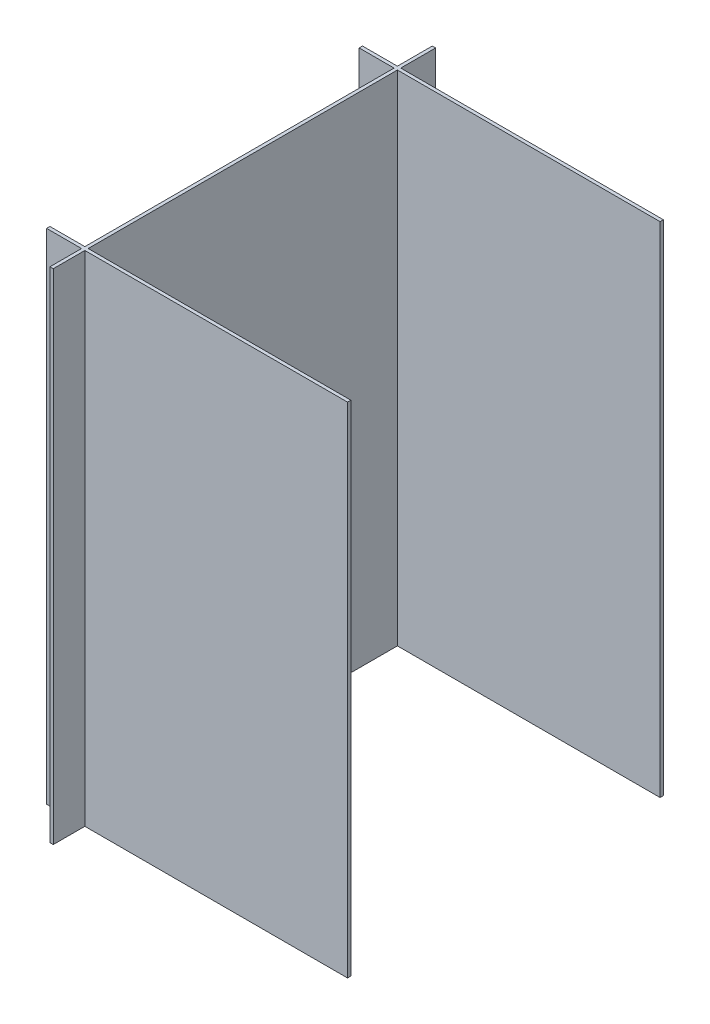
ISO-10303-21;
HEADER;
FILE_DESCRIPTION(('STEP AP214'),'2;1');
FILE_NAME('part.step','',(''),(''),'','','');
FILE_SCHEMA(('AUTOMOTIVE_DESIGN { 1 0 10303 214 1 1 1 1 }'));
ENDSEC;
DATA;
#1=APPLICATION_CONTEXT('core data for automotive mechanical design processes');
#2=APPLICATION_PROTOCOL_DEFINITION('international standard','automotive_design',2000,#1);
#3=PRODUCT_CONTEXT('',#1,'mechanical');
#4=PRODUCT('Part','Part','',(#3));
#5=PRODUCT_RELATED_PRODUCT_CATEGORY('part','',(#4));
#6=PRODUCT_DEFINITION_FORMATION('','',#4);
#7=PRODUCT_DEFINITION_CONTEXT('part definition',#1,'design');
#8=PRODUCT_DEFINITION('design','',#6,#7);
#9=PRODUCT_DEFINITION_SHAPE('','',#8);
#10=(LENGTH_UNIT() NAMED_UNIT(*) SI_UNIT(.MILLI.,.METRE.));
#11=(NAMED_UNIT(*) PLANE_ANGLE_UNIT() SI_UNIT($,.RADIAN.));
#12=(NAMED_UNIT(*) SI_UNIT($,.STERADIAN.) SOLID_ANGLE_UNIT());
#13=UNCERTAINTY_MEASURE_WITH_UNIT(LENGTH_MEASURE(1.E-05),#10,'distance_accuracy_value','');
#14=(GEOMETRIC_REPRESENTATION_CONTEXT(3) GLOBAL_UNCERTAINTY_ASSIGNED_CONTEXT((#13)) GLOBAL_UNIT_ASSIGNED_CONTEXT((#10,
#11,#12)) REPRESENTATION_CONTEXT('',''));
#15=CARTESIAN_POINT('',(0.,0.,0.));
#16=DIRECTION('',(0.,0.,1.));
#17=DIRECTION('',(1.,0.,0.));
#18=AXIS2_PLACEMENT_3D('',#15,#16,#17);
#19=CARTESIAN_POINT('',(-56.1616111521953,300.,42.3022668872637));
#20=DIRECTION('',(1.,0.,0.));
#21=DIRECTION('',(0.,0.,-1.));
#22=AXIS2_PLACEMENT_3D('',#19,#20,#21);
#23=PLANE('',#22);
#24=DIRECTION('',(0.,0.,1.));
#25=VECTOR('',#24,1.);
#26=CARTESIAN_POINT('',(-56.1616111521953,0.,42.3022668872637));
#27=LINE('',#26,#25);
#28=CARTESIAN_POINT('',(-56.1616111521953,0.,42.3022668872637));
#29=VERTEX_POINT('',#28);
#30=CARTESIAN_POINT('',(-56.1616111521953,0.,44.3022668872637));
#31=VERTEX_POINT('',#30);
#32=EDGE_CURVE('E206',#29,#31,#27,.T.);
#33=ORIENTED_EDGE('',*,*,#32,.T.);
#34=DIRECTION('',(0.,-1.,0.));
#35=VECTOR('',#34,1.);
#36=CARTESIAN_POINT('',(-56.1616111521953,300.,44.3022668872637));
#37=LINE('',#36,#35);
#38=CARTESIAN_POINT('',(-56.1616111521953,300.,44.3022668872637));
#39=VERTEX_POINT('',#38);
#40=EDGE_CURVE('E11',#39,#31,#37,.T.);
#41=ORIENTED_EDGE('',*,*,#40,.F.);
#42=DIRECTION('',(0.,0.,1.));
#43=VECTOR('',#42,1.);
#44=CARTESIAN_POINT('',(-56.1616111521953,300.,42.3022668872637));
#45=LINE('',#44,#43);
#46=CARTESIAN_POINT('',(-56.1616111521953,300.,42.3022668872637));
#47=VERTEX_POINT('',#46);
#48=EDGE_CURVE('E244',#47,#39,#45,.T.);
#49=ORIENTED_EDGE('',*,*,#48,.F.);
#50=DIRECTION('',(0.,-1.,0.));
#51=VECTOR('',#50,1.);
#52=CARTESIAN_POINT('',(-56.1616111521953,300.,42.3022668872637));
#53=LINE('',#52,#51);
#54=EDGE_CURVE('E202',#47,#29,#53,.T.);
#55=ORIENTED_EDGE('',*,*,#54,.T.);
#56=EDGE_LOOP('',(#33,#41,#49,#55));
#57=FACE_BOUND('',#56,.T.);
#58=ADVANCED_FACE('F38',(#57),#23,.F.);
#59=CARTESIAN_POINT('',(-56.1616111521953,300.,44.3022668872637));
#60=DIRECTION('',(0.,0.,-1.));
#61=DIRECTION('',(-1.,0.,0.));
#62=AXIS2_PLACEMENT_3D('',#59,#60,#61);
#63=PLANE('',#62);
#64=DIRECTION('',(1.,0.,0.));
#65=VECTOR('',#64,1.);
#66=CARTESIAN_POINT('',(-56.1616111521953,0.,44.3022668872637));
#67=LINE('',#66,#65);
#68=CARTESIAN_POINT('',(-35.1616111521953,0.,44.3022668872637));
#69=VERTEX_POINT('',#68);
#70=EDGE_CURVE('E209',#31,#69,#67,.T.);
#71=ORIENTED_EDGE('',*,*,#70,.T.);
#72=DIRECTION('',(0.,-1.,0.));
#73=VECTOR('',#72,1.);
#74=CARTESIAN_POINT('',(-35.1616111521953,300.,44.3022668872637));
#75=LINE('',#74,#73);
#76=CARTESIAN_POINT('',(-35.1616111521953,300.,44.3022668872637));
#77=VERTEX_POINT('',#76);
#78=EDGE_CURVE('E46',#77,#69,#75,.T.);
#79=ORIENTED_EDGE('',*,*,#78,.F.);
#80=DIRECTION('',(1.,0.,0.));
#81=VECTOR('',#80,1.);
#82=CARTESIAN_POINT('',(-56.1616111521953,300.,44.3022668872637));
#83=LINE('',#82,#81);
#84=EDGE_CURVE('E133',#39,#77,#83,.T.);
#85=ORIENTED_EDGE('',*,*,#84,.F.);
#86=ORIENTED_EDGE('',*,*,#40,.T.);
#87=EDGE_LOOP('',(#71,#79,#85,#86));
#88=FACE_BOUND('',#87,.T.);
#89=ADVANCED_FACE('F362',(#88),#63,.F.);
#90=CARTESIAN_POINT('',(-35.1616111521953,300.,44.3022668872637));
#91=DIRECTION('',(1.,0.,0.));
#92=DIRECTION('',(0.,0.,-1.));
#93=AXIS2_PLACEMENT_3D('',#90,#91,#92);
#94=PLANE('',#93);
#95=DIRECTION('',(0.,0.,1.));
#96=VECTOR('',#95,1.);
#97=CARTESIAN_POINT('',(-35.1616111521953,0.,44.3022668872637));
#98=LINE('',#97,#96);
#99=CARTESIAN_POINT('',(-35.1616111521953,0.,230.302266887264));
#100=VERTEX_POINT('',#99);
#101=EDGE_CURVE('E211',#69,#100,#98,.T.);
#102=ORIENTED_EDGE('',*,*,#101,.T.);
#103=DIRECTION('',(0.,-1.,0.));
#104=VECTOR('',#103,1.);
#105=CARTESIAN_POINT('',(-35.1616111521953,300.,230.302266887264));
#106=LINE('',#105,#104);
#107=CARTESIAN_POINT('',(-35.1616111521953,300.,230.302266887264));
#108=VERTEX_POINT('',#107);
#109=EDGE_CURVE('E287',#108,#100,#106,.T.);
#110=ORIENTED_EDGE('',*,*,#109,.F.);
#111=DIRECTION('',(0.,0.,1.));
#112=VECTOR('',#111,1.);
#113=CARTESIAN_POINT('',(-35.1616111521953,300.,44.3022668872637));
#114=LINE('',#113,#112);
#115=EDGE_CURVE('E295',#77,#108,#114,.T.);
#116=ORIENTED_EDGE('',*,*,#115,.F.);
#117=ORIENTED_EDGE('',*,*,#78,.T.);
#118=EDGE_LOOP('',(#102,#110,#116,#117));
#119=FACE_BOUND('',#118,.T.);
#120=ADVANCED_FACE('F293',(#119),#94,.F.);
#121=CARTESIAN_POINT('',(-35.1616111521953,300.,230.302266887264));
#122=DIRECTION('',(0.,0.,1.));
#123=DIRECTION('',(1.,0.,0.));
#124=AXIS2_PLACEMENT_3D('',#121,#122,#123);
#125=PLANE('',#124);
#126=DIRECTION('',(-1.,0.,0.));
#127=VECTOR('',#126,1.);
#128=CARTESIAN_POINT('',(-35.1616111521953,0.,230.302266887264));
#129=LINE('',#128,#127);
#130=CARTESIAN_POINT('',(-56.1616111521953,0.,230.302266887264));
#131=VERTEX_POINT('',#130);
#132=EDGE_CURVE('E213',#100,#131,#129,.T.);
#133=ORIENTED_EDGE('',*,*,#132,.T.);
#134=DIRECTION('',(0.,-1.,0.));
#135=VECTOR('',#134,1.);
#136=CARTESIAN_POINT('',(-56.1616111521953,300.,230.302266887264));
#137=LINE('',#136,#135);
#138=CARTESIAN_POINT('',(-56.1616111521953,300.,230.302266887264));
#139=VERTEX_POINT('',#138);
#140=EDGE_CURVE('E284',#139,#131,#137,.T.);
#141=ORIENTED_EDGE('',*,*,#140,.F.);
#142=DIRECTION('',(-1.,0.,0.));
#143=VECTOR('',#142,1.);
#144=CARTESIAN_POINT('',(-35.1616111521953,300.,230.302266887264));
#145=LINE('',#144,#143);
#146=EDGE_CURVE('E313',#108,#139,#145,.T.);
#147=ORIENTED_EDGE('',*,*,#146,.F.);
#148=ORIENTED_EDGE('',*,*,#109,.T.);
#149=EDGE_LOOP('',(#133,#141,#147,#148));
#150=FACE_BOUND('',#149,.T.);
#151=ADVANCED_FACE('F304',(#150),#125,.F.);
#152=CARTESIAN_POINT('',(-56.1616111521953,300.,230.302266887264));
#153=DIRECTION('',(1.,0.,0.));
#154=DIRECTION('',(0.,0.,-1.));
#155=AXIS2_PLACEMENT_3D('',#152,#153,#154);
#156=PLANE('',#155);
#157=DIRECTION('',(0.,0.,1.));
#158=VECTOR('',#157,1.);
#159=CARTESIAN_POINT('',(-56.1616111521953,0.,230.302266887264));
#160=LINE('',#159,#158);
#161=CARTESIAN_POINT('',(-56.1616111521953,0.,232.302266887264));
#162=VERTEX_POINT('',#161);
#163=EDGE_CURVE('E215',#131,#162,#160,.T.);
#164=ORIENTED_EDGE('',*,*,#163,.T.);
#165=DIRECTION('',(0.,-1.,0.));
#166=VECTOR('',#165,1.);
#167=CARTESIAN_POINT('',(-56.1616111521953,300.,232.302266887264));
#168=LINE('',#167,#166);
#169=CARTESIAN_POINT('',(-56.1616111521953,300.,232.302266887264));
#170=VERTEX_POINT('',#169);
#171=EDGE_CURVE('E281',#170,#162,#168,.T.);
#172=ORIENTED_EDGE('',*,*,#171,.F.);
#173=DIRECTION('',(0.,0.,1.));
#174=VECTOR('',#173,1.);
#175=CARTESIAN_POINT('',(-56.1616111521953,300.,230.302266887264));
#176=LINE('',#175,#174);
#177=EDGE_CURVE('E310',#139,#170,#176,.T.);
#178=ORIENTED_EDGE('',*,*,#177,.F.);
#179=ORIENTED_EDGE('',*,*,#140,.T.);
#180=EDGE_LOOP('',(#164,#172,#178,#179));
#181=FACE_BOUND('',#180,.T.);
#182=ADVANCED_FACE('F308',(#181),#156,.F.);
#183=CARTESIAN_POINT('',(-56.1616111521953,300.,232.302266887264));
#184=DIRECTION('',(0.,0.,-1.));
#185=DIRECTION('',(-1.,0.,0.));
#186=AXIS2_PLACEMENT_3D('',#183,#184,#185);
#187=PLANE('',#186);
#188=DIRECTION('',(1.,0.,0.));
#189=VECTOR('',#188,1.);
#190=CARTESIAN_POINT('',(-56.1616111521953,0.,232.302266887264));
#191=LINE('',#190,#189);
#192=CARTESIAN_POINT('',(-35.1616111521953,0.,232.302266887264));
#193=VERTEX_POINT('',#192);
#194=EDGE_CURVE('E217',#162,#193,#191,.T.);
#195=ORIENTED_EDGE('',*,*,#194,.T.);
#196=DIRECTION('',(0.,-1.,0.));
#197=VECTOR('',#196,1.);
#198=CARTESIAN_POINT('',(-35.1616111521953,300.,232.302266887264));
#199=LINE('',#198,#197);
#200=CARTESIAN_POINT('',(-35.1616111521953,300.,232.302266887264));
#201=VERTEX_POINT('',#200);
#202=EDGE_CURVE('E278',#201,#193,#199,.T.);
#203=ORIENTED_EDGE('',*,*,#202,.F.);
#204=DIRECTION('',(1.,0.,0.));
#205=VECTOR('',#204,1.);
#206=CARTESIAN_POINT('',(-56.1616111521953,300.,232.302266887264));
#207=LINE('',#206,#205);
#208=EDGE_CURVE('E312',#170,#201,#207,.T.);
#209=ORIENTED_EDGE('',*,*,#208,.F.);
#210=ORIENTED_EDGE('',*,*,#171,.T.);
#211=EDGE_LOOP('',(#195,#203,#209,#210));
#212=FACE_BOUND('',#211,.T.);
#213=ADVANCED_FACE('F375',(#212),#187,.F.);
#214=CARTESIAN_POINT('',(-35.1616111521953,300.,232.302266887264));
#215=DIRECTION('',(1.,0.,0.));
#216=DIRECTION('',(0.,0.,-1.));
#217=AXIS2_PLACEMENT_3D('',#214,#215,#216);
#218=PLANE('',#217);
#219=DIRECTION('',(0.,0.,1.));
#220=VECTOR('',#219,1.);
#221=CARTESIAN_POINT('',(-35.1616111521953,0.,232.302266887264));
#222=LINE('',#221,#220);
#223=CARTESIAN_POINT('',(-35.1616111521953,0.,251.302266887264));
#224=VERTEX_POINT('',#223);
#225=EDGE_CURVE('E219',#193,#224,#222,.T.);
#226=ORIENTED_EDGE('',*,*,#225,.T.);
#227=DIRECTION('',(0.,-1.,0.));
#228=VECTOR('',#227,1.);
#229=CARTESIAN_POINT('',(-35.1616111521953,300.,251.302266887264));
#230=LINE('',#229,#228);
#231=CARTESIAN_POINT('',(-35.1616111521953,300.,251.302266887264));
#232=VERTEX_POINT('',#231);
#233=EDGE_CURVE('E275',#232,#224,#230,.T.);
#234=ORIENTED_EDGE('',*,*,#233,.F.);
#235=DIRECTION('',(0.,0.,1.));
#236=VECTOR('',#235,1.);
#237=CARTESIAN_POINT('',(-35.1616111521953,300.,232.302266887264));
#238=LINE('',#237,#236);
#239=EDGE_CURVE('E315',#201,#232,#238,.T.);
#240=ORIENTED_EDGE('',*,*,#239,.F.);
#241=ORIENTED_EDGE('',*,*,#202,.T.);
#242=EDGE_LOOP('',(#226,#234,#240,#241));
#243=FACE_BOUND('',#242,.T.);
#244=ADVANCED_FACE('F378',(#243),#218,.F.);
#245=CARTESIAN_POINT('',(-35.1616111521953,300.,251.302266887264));
#246=DIRECTION('',(0.,0.,-1.));
#247=DIRECTION('',(-1.,0.,0.));
#248=AXIS2_PLACEMENT_3D('',#245,#246,#247);
#249=PLANE('',#248);
#250=DIRECTION('',(1.,0.,0.));
#251=VECTOR('',#250,1.);
#252=CARTESIAN_POINT('',(-35.1616111521953,0.,251.302266887264));
#253=LINE('',#252,#251);
#254=CARTESIAN_POINT('',(-33.1616111521953,0.,251.302266887264));
#255=VERTEX_POINT('',#254);
#256=EDGE_CURVE('E221',#224,#255,#253,.T.);
#257=ORIENTED_EDGE('',*,*,#256,.T.);
#258=DIRECTION('',(0.,-1.,0.));
#259=VECTOR('',#258,1.);
#260=CARTESIAN_POINT('',(-33.1616111521953,300.,251.302266887264));
#261=LINE('',#260,#259);
#262=CARTESIAN_POINT('',(-33.1616111521953,300.,251.302266887264));
#263=VERTEX_POINT('',#262);
#264=EDGE_CURVE('E272',#263,#255,#261,.T.);
#265=ORIENTED_EDGE('',*,*,#264,.F.);
#266=DIRECTION('',(1.,0.,0.));
#267=VECTOR('',#266,1.);
#268=CARTESIAN_POINT('',(-35.1616111521953,300.,251.302266887264));
#269=LINE('',#268,#267);
#270=EDGE_CURVE('E321',#232,#263,#269,.T.);
#271=ORIENTED_EDGE('',*,*,#270,.F.);
#272=ORIENTED_EDGE('',*,*,#233,.T.);
#273=EDGE_LOOP('',(#257,#265,#271,#272));
#274=FACE_BOUND('',#273,.T.);
#275=ADVANCED_FACE('F382',(#274),#249,.F.);
#276=CARTESIAN_POINT('',(-33.1616111521953,300.,232.302266887264));
#277=DIRECTION('',(-1.,0.,0.));
#278=DIRECTION('',(0.,0.,1.));
#279=AXIS2_PLACEMENT_3D('',#276,#277,#278);
#280=PLANE('',#279);
#281=DIRECTION('',(0.,0.,-1.));
#282=VECTOR('',#281,1.);
#283=CARTESIAN_POINT('',(-33.1616111521953,0.,232.302266887264));
#284=LINE('',#283,#282);
#285=CARTESIAN_POINT('',(-33.1616111521953,0.,232.302266887264));
#286=VERTEX_POINT('',#285);
#287=EDGE_CURVE('E223',#255,#286,#284,.T.);
#288=ORIENTED_EDGE('',*,*,#287,.T.);
#289=DIRECTION('',(0.,-1.,0.));
#290=VECTOR('',#289,1.);
#291=CARTESIAN_POINT('',(-33.1616111521953,300.,232.302266887264));
#292=LINE('',#291,#290);
#293=CARTESIAN_POINT('',(-33.1616111521953,300.,232.302266887264));
#294=VERTEX_POINT('',#293);
#295=EDGE_CURVE('E269',#294,#286,#292,.T.);
#296=ORIENTED_EDGE('',*,*,#295,.F.);
#297=DIRECTION('',(0.,0.,-1.));
#298=VECTOR('',#297,1.);
#299=CARTESIAN_POINT('',(-33.1616111521953,300.,232.302266887264));
#300=LINE('',#299,#298);
#301=EDGE_CURVE('E323',#263,#294,#300,.T.);
#302=ORIENTED_EDGE('',*,*,#301,.F.);
#303=ORIENTED_EDGE('',*,*,#264,.T.);
#304=EDGE_LOOP('',(#288,#296,#302,#303));
#305=FACE_BOUND('',#304,.T.);
#306=ADVANCED_FACE('F386',(#305),#280,.F.);
#307=CARTESIAN_POINT('',(-33.1616111521953,300.,232.302266887264));
#308=DIRECTION('',(0.,0.,-1.));
#309=DIRECTION('',(-1.,0.,0.));
#310=AXIS2_PLACEMENT_3D('',#307,#308,#309);
#311=PLANE('',#310);
#312=DIRECTION('',(1.,0.,0.));
#313=VECTOR('',#312,1.);
#314=CARTESIAN_POINT('',(-33.1616111521953,0.,232.302266887264));
#315=LINE('',#314,#313);
#316=CARTESIAN_POINT('',(124.838388847805,0.,232.302266887264));
#317=VERTEX_POINT('',#316);
#318=EDGE_CURVE('E225',#286,#317,#315,.T.);
#319=ORIENTED_EDGE('',*,*,#318,.T.);
#320=DIRECTION('',(0.,-1.,0.));
#321=VECTOR('',#320,1.);
#322=CARTESIAN_POINT('',(124.838388847805,300.,232.302266887264));
#323=LINE('',#322,#321);
#324=CARTESIAN_POINT('',(124.838388847805,300.,232.302266887264));
#325=VERTEX_POINT('',#324);
#326=EDGE_CURVE('E266',#325,#317,#323,.T.);
#327=ORIENTED_EDGE('',*,*,#326,.F.);
#328=DIRECTION('',(1.,0.,0.));
#329=VECTOR('',#328,1.);
#330=CARTESIAN_POINT('',(-33.1616111521953,300.,232.302266887264));
#331=LINE('',#330,#329);
#332=EDGE_CURVE('E325',#294,#325,#331,.T.);
#333=ORIENTED_EDGE('',*,*,#332,.F.);
#334=ORIENTED_EDGE('',*,*,#295,.T.);
#335=EDGE_LOOP('',(#319,#327,#333,#334));
#336=FACE_BOUND('',#335,.T.);
#337=ADVANCED_FACE('F390',(#336),#311,.F.);
#338=CARTESIAN_POINT('',(124.838388847805,300.,230.302266887264));
#339=DIRECTION('',(-1.,0.,0.));
#340=DIRECTION('',(0.,0.,1.));
#341=AXIS2_PLACEMENT_3D('',#338,#339,#340);
#342=PLANE('',#341);
#343=DIRECTION('',(0.,0.,-1.));
#344=VECTOR('',#343,1.);
#345=CARTESIAN_POINT('',(124.838388847805,0.,230.302266887264));
#346=LINE('',#345,#344);
#347=CARTESIAN_POINT('',(124.838388847805,0.,230.302266887264));
#348=VERTEX_POINT('',#347);
#349=EDGE_CURVE('E227',#317,#348,#346,.T.);
#350=ORIENTED_EDGE('',*,*,#349,.T.);
#351=DIRECTION('',(0.,-1.,0.));
#352=VECTOR('',#351,1.);
#353=CARTESIAN_POINT('',(124.838388847805,300.,230.302266887264));
#354=LINE('',#353,#352);
#355=CARTESIAN_POINT('',(124.838388847805,300.,230.302266887264));
#356=VERTEX_POINT('',#355);
#357=EDGE_CURVE('E263',#356,#348,#354,.T.);
#358=ORIENTED_EDGE('',*,*,#357,.F.);
#359=DIRECTION('',(0.,0.,-1.));
#360=VECTOR('',#359,1.);
#361=CARTESIAN_POINT('',(124.838388847805,300.,230.302266887264));
#362=LINE('',#361,#360);
#363=EDGE_CURVE('E327',#325,#356,#362,.T.);
#364=ORIENTED_EDGE('',*,*,#363,.F.);
#365=ORIENTED_EDGE('',*,*,#326,.T.);
#366=EDGE_LOOP('',(#350,#358,#364,#365));
#367=FACE_BOUND('',#366,.T.);
#368=ADVANCED_FACE('F394',(#367),#342,.F.);
#369=CARTESIAN_POINT('',(-33.1616111521953,300.,230.302266887264));
#370=DIRECTION('',(0.,0.,1.));
#371=DIRECTION('',(1.,0.,0.));
#372=AXIS2_PLACEMENT_3D('',#369,#370,#371);
#373=PLANE('',#372);
#374=DIRECTION('',(-1.,0.,0.));
#375=VECTOR('',#374,1.);
#376=CARTESIAN_POINT('',(-33.1616111521953,0.,230.302266887264));
#377=LINE('',#376,#375);
#378=CARTESIAN_POINT('',(-33.1616111521953,0.,230.302266887264));
#379=VERTEX_POINT('',#378);
#380=EDGE_CURVE('E229',#348,#379,#377,.T.);
#381=ORIENTED_EDGE('',*,*,#380,.T.);
#382=DIRECTION('',(0.,-1.,0.));
#383=VECTOR('',#382,1.);
#384=CARTESIAN_POINT('',(-33.1616111521953,300.,230.302266887264));
#385=LINE('',#384,#383);
#386=CARTESIAN_POINT('',(-33.1616111521953,300.,230.302266887264));
#387=VERTEX_POINT('',#386);
#388=EDGE_CURVE('E260',#387,#379,#385,.T.);
#389=ORIENTED_EDGE('',*,*,#388,.F.);
#390=DIRECTION('',(-1.,0.,0.));
#391=VECTOR('',#390,1.);
#392=CARTESIAN_POINT('',(-33.1616111521953,300.,230.302266887264));
#393=LINE('',#392,#391);
#394=EDGE_CURVE('E329',#356,#387,#393,.T.);
#395=ORIENTED_EDGE('',*,*,#394,.F.);
#396=ORIENTED_EDGE('',*,*,#357,.T.);
#397=EDGE_LOOP('',(#381,#389,#395,#396));
#398=FACE_BOUND('',#397,.T.);
#399=ADVANCED_FACE('F398',(#398),#373,.F.);
#400=CARTESIAN_POINT('',(-33.1616111521953,300.,44.3022668872637));
#401=DIRECTION('',(-1.,0.,0.));
#402=DIRECTION('',(0.,0.,1.));
#403=AXIS2_PLACEMENT_3D('',#400,#401,#402);
#404=PLANE('',#403);
#405=DIRECTION('',(0.,0.,-1.));
#406=VECTOR('',#405,1.);
#407=CARTESIAN_POINT('',(-33.1616111521953,0.,44.3022668872637));
#408=LINE('',#407,#406);
#409=CARTESIAN_POINT('',(-33.1616111521953,0.,44.3022668872637));
#410=VERTEX_POINT('',#409);
#411=EDGE_CURVE('E231',#379,#410,#408,.T.);
#412=ORIENTED_EDGE('',*,*,#411,.T.);
#413=DIRECTION('',(0.,-1.,0.));
#414=VECTOR('',#413,1.);
#415=CARTESIAN_POINT('',(-33.1616111521953,300.,44.3022668872637));
#416=LINE('',#415,#414);
#417=CARTESIAN_POINT('',(-33.1616111521953,300.,44.3022668872637));
#418=VERTEX_POINT('',#417);
#419=EDGE_CURVE('E257',#418,#410,#416,.T.);
#420=ORIENTED_EDGE('',*,*,#419,.F.);
#421=DIRECTION('',(0.,0.,-1.));
#422=VECTOR('',#421,1.);
#423=CARTESIAN_POINT('',(-33.1616111521953,300.,44.3022668872637));
#424=LINE('',#423,#422);
#425=EDGE_CURVE('E331',#387,#418,#424,.T.);
#426=ORIENTED_EDGE('',*,*,#425,.F.);
#427=ORIENTED_EDGE('',*,*,#388,.T.);
#428=EDGE_LOOP('',(#412,#420,#426,#427));
#429=FACE_BOUND('',#428,.T.);
#430=ADVANCED_FACE('F402',(#429),#404,.F.);
#431=CARTESIAN_POINT('',(-33.1616111521953,300.,44.3022668872637));
#432=DIRECTION('',(0.,0.,-1.));
#433=DIRECTION('',(-1.,0.,0.));
#434=AXIS2_PLACEMENT_3D('',#431,#432,#433);
#435=PLANE('',#434);
#436=DIRECTION('',(1.,0.,0.));
#437=VECTOR('',#436,1.);
#438=CARTESIAN_POINT('',(-33.1616111521953,0.,44.3022668872637));
#439=LINE('',#438,#437);
#440=CARTESIAN_POINT('',(124.838388847805,0.,44.3022668872637));
#441=VERTEX_POINT('',#440);
#442=EDGE_CURVE('E233',#410,#441,#439,.T.);
#443=ORIENTED_EDGE('',*,*,#442,.T.);
#444=DIRECTION('',(0.,-1.,0.));
#445=VECTOR('',#444,1.);
#446=CARTESIAN_POINT('',(124.838388847805,300.,44.3022668872637));
#447=LINE('',#446,#445);
#448=CARTESIAN_POINT('',(124.838388847805,300.,44.3022668872637));
#449=VERTEX_POINT('',#448);
#450=EDGE_CURVE('E254',#449,#441,#447,.T.);
#451=ORIENTED_EDGE('',*,*,#450,.F.);
#452=DIRECTION('',(1.,0.,0.));
#453=VECTOR('',#452,1.);
#454=CARTESIAN_POINT('',(-33.1616111521953,300.,44.3022668872637));
#455=LINE('',#454,#453);
#456=EDGE_CURVE('E333',#418,#449,#455,.T.);
#457=ORIENTED_EDGE('',*,*,#456,.F.);
#458=ORIENTED_EDGE('',*,*,#419,.T.);
#459=EDGE_LOOP('',(#443,#451,#457,#458));
#460=FACE_BOUND('',#459,.T.);
#461=ADVANCED_FACE('F406',(#460),#435,.F.);
#462=CARTESIAN_POINT('',(124.838388847805,300.,42.3022668872637));
#463=DIRECTION('',(-1.,0.,0.));
#464=DIRECTION('',(0.,0.,1.));
#465=AXIS2_PLACEMENT_3D('',#462,#463,#464);
#466=PLANE('',#465);
#467=DIRECTION('',(0.,0.,-1.));
#468=VECTOR('',#467,1.);
#469=CARTESIAN_POINT('',(124.838388847805,0.,42.3022668872637));
#470=LINE('',#469,#468);
#471=CARTESIAN_POINT('',(124.838388847805,0.,42.3022668872637));
#472=VERTEX_POINT('',#471);
#473=EDGE_CURVE('E235',#441,#472,#470,.T.);
#474=ORIENTED_EDGE('',*,*,#473,.T.);
#475=DIRECTION('',(0.,-1.,0.));
#476=VECTOR('',#475,1.);
#477=CARTESIAN_POINT('',(124.838388847805,300.,42.3022668872637));
#478=LINE('',#477,#476);
#479=CARTESIAN_POINT('',(124.838388847805,300.,42.3022668872637));
#480=VERTEX_POINT('',#479);
#481=EDGE_CURVE('E251',#480,#472,#478,.T.);
#482=ORIENTED_EDGE('',*,*,#481,.F.);
#483=DIRECTION('',(0.,0.,-1.));
#484=VECTOR('',#483,1.);
#485=CARTESIAN_POINT('',(124.838388847805,300.,42.3022668872637));
#486=LINE('',#485,#484);
#487=EDGE_CURVE('E335',#449,#480,#486,.T.);
#488=ORIENTED_EDGE('',*,*,#487,.F.);
#489=ORIENTED_EDGE('',*,*,#450,.T.);
#490=EDGE_LOOP('',(#474,#482,#488,#489));
#491=FACE_BOUND('',#490,.T.);
#492=ADVANCED_FACE('F410',(#491),#466,.F.);
#493=CARTESIAN_POINT('',(-33.1616111521953,300.,42.3022668872637));
#494=DIRECTION('',(0.,0.,1.));
#495=DIRECTION('',(1.,0.,0.));
#496=AXIS2_PLACEMENT_3D('',#493,#494,#495);
#497=PLANE('',#496);
#498=DIRECTION('',(-1.,0.,0.));
#499=VECTOR('',#498,1.);
#500=CARTESIAN_POINT('',(-33.1616111521953,0.,42.3022668872637));
#501=LINE('',#500,#499);
#502=CARTESIAN_POINT('',(-33.1616111521953,0.,42.3022668872637));
#503=VERTEX_POINT('',#502);
#504=EDGE_CURVE('E237',#472,#503,#501,.T.);
#505=ORIENTED_EDGE('',*,*,#504,.T.);
#506=DIRECTION('',(0.,-1.,0.));
#507=VECTOR('',#506,1.);
#508=CARTESIAN_POINT('',(-33.1616111521953,300.,42.3022668872637));
#509=LINE('',#508,#507);
#510=CARTESIAN_POINT('',(-33.1616111521953,300.,42.3022668872637));
#511=VERTEX_POINT('',#510);
#512=EDGE_CURVE('E248',#511,#503,#509,.T.);
#513=ORIENTED_EDGE('',*,*,#512,.F.);
#514=DIRECTION('',(-1.,0.,0.));
#515=VECTOR('',#514,1.);
#516=CARTESIAN_POINT('',(-33.1616111521953,300.,42.3022668872637));
#517=LINE('',#516,#515);
#518=EDGE_CURVE('E337',#480,#511,#517,.T.);
#519=ORIENTED_EDGE('',*,*,#518,.F.);
#520=ORIENTED_EDGE('',*,*,#481,.T.);
#521=EDGE_LOOP('',(#505,#513,#519,#520));
#522=FACE_BOUND('',#521,.T.);
#523=ADVANCED_FACE('F343',(#522),#497,.F.);
#524=CARTESIAN_POINT('',(-33.1616111521953,300.,42.3022668872637));
#525=DIRECTION('',(-1.,0.,0.));
#526=DIRECTION('',(0.,0.,1.));
#527=AXIS2_PLACEMENT_3D('',#524,#525,#526);
#528=PLANE('',#527);
#529=DIRECTION('',(0.,0.,-1.));
#530=VECTOR('',#529,1.);
#531=CARTESIAN_POINT('',(-33.1616111521953,0.,42.3022668872637));
#532=LINE('',#531,#530);
#533=CARTESIAN_POINT('',(-33.1616111521953,0.,21.3022668872637));
#534=VERTEX_POINT('',#533);
#535=EDGE_CURVE('E239',#503,#534,#532,.T.);
#536=ORIENTED_EDGE('',*,*,#535,.T.);
#537=DIRECTION('',(0.,-1.,0.));
#538=VECTOR('',#537,1.);
#539=CARTESIAN_POINT('',(-33.1616111521953,300.,21.3022668872637));
#540=LINE('',#539,#538);
#541=CARTESIAN_POINT('',(-33.1616111521953,300.,21.3022668872637));
#542=VERTEX_POINT('',#541);
#543=EDGE_CURVE('E197',#542,#534,#540,.T.);
#544=ORIENTED_EDGE('',*,*,#543,.F.);
#545=DIRECTION('',(0.,0.,-1.));
#546=VECTOR('',#545,1.);
#547=CARTESIAN_POINT('',(-33.1616111521953,300.,42.3022668872637));
#548=LINE('',#547,#546);
#549=EDGE_CURVE('E188',#511,#542,#548,.T.);
#550=ORIENTED_EDGE('',*,*,#549,.F.);
#551=ORIENTED_EDGE('',*,*,#512,.T.);
#552=EDGE_LOOP('',(#536,#544,#550,#551));
#553=FACE_BOUND('',#552,.T.);
#554=ADVANCED_FACE('F347',(#553),#528,.F.);
#555=CARTESIAN_POINT('',(-35.1616111521953,300.,21.3022668872637));
#556=DIRECTION('',(0.,0.,1.));
#557=DIRECTION('',(1.,0.,0.));
#558=AXIS2_PLACEMENT_3D('',#555,#556,#557);
#559=PLANE('',#558);
#560=DIRECTION('',(-1.,0.,0.));
#561=VECTOR('',#560,1.);
#562=CARTESIAN_POINT('',(-35.1616111521953,0.,21.3022668872637));
#563=LINE('',#562,#561);
#564=CARTESIAN_POINT('',(-35.1616111521953,0.,21.3022668872637));
#565=VERTEX_POINT('',#564);
#566=EDGE_CURVE('E196',#534,#565,#563,.T.);
#567=ORIENTED_EDGE('',*,*,#566,.T.);
#568=DIRECTION('',(0.,-1.,0.));
#569=VECTOR('',#568,1.);
#570=CARTESIAN_POINT('',(-35.1616111521953,300.,21.3022668872637));
#571=LINE('',#570,#569);
#572=CARTESIAN_POINT('',(-35.1616111521953,300.,21.3022668872637));
#573=VERTEX_POINT('',#572);
#574=EDGE_CURVE('E193',#573,#565,#571,.T.);
#575=ORIENTED_EDGE('',*,*,#574,.F.);
#576=DIRECTION('',(-1.,0.,0.));
#577=VECTOR('',#576,1.);
#578=CARTESIAN_POINT('',(-35.1616111521953,300.,21.3022668872637));
#579=LINE('',#578,#577);
#580=EDGE_CURVE('E182',#542,#573,#579,.T.);
#581=ORIENTED_EDGE('',*,*,#580,.F.);
#582=ORIENTED_EDGE('',*,*,#543,.T.);
#583=EDGE_LOOP('',(#567,#575,#581,#582));
#584=FACE_BOUND('',#583,.T.);
#585=ADVANCED_FACE('F194',(#584),#559,.F.);
#586=CARTESIAN_POINT('',(-35.1616111521953,300.,42.3022668872637));
#587=DIRECTION('',(1.,0.,0.));
#588=DIRECTION('',(0.,0.,-1.));
#589=AXIS2_PLACEMENT_3D('',#586,#587,#588);
#590=PLANE('',#589);
#591=DIRECTION('',(0.,0.,1.));
#592=VECTOR('',#591,1.);
#593=CARTESIAN_POINT('',(-35.1616111521953,0.,42.3022668872637));
#594=LINE('',#593,#592);
#595=CARTESIAN_POINT('',(-35.1616111521953,0.,42.3022668872637));
#596=VERTEX_POINT('',#595);
#597=EDGE_CURVE('E119',#565,#596,#594,.T.);
#598=ORIENTED_EDGE('',*,*,#597,.T.);
#599=DIRECTION('',(0.,-1.,0.));
#600=VECTOR('',#599,1.);
#601=CARTESIAN_POINT('',(-35.1616111521953,300.,42.3022668872637));
#602=LINE('',#601,#600);
#603=CARTESIAN_POINT('',(-35.1616111521953,300.,42.3022668872637));
#604=VERTEX_POINT('',#603);
#605=EDGE_CURVE('E198',#604,#596,#602,.T.);
#606=ORIENTED_EDGE('',*,*,#605,.F.);
#607=DIRECTION('',(0.,0.,1.));
#608=VECTOR('',#607,1.);
#609=CARTESIAN_POINT('',(-35.1616111521953,300.,42.3022668872637));
#610=LINE('',#609,#608);
#611=EDGE_CURVE('E186',#573,#604,#610,.T.);
#612=ORIENTED_EDGE('',*,*,#611,.F.);
#613=ORIENTED_EDGE('',*,*,#574,.T.);
#614=EDGE_LOOP('',(#598,#606,#612,#613));
#615=FACE_BOUND('',#614,.T.);
#616=ADVANCED_FACE('F200',(#615),#590,.F.);
#617=CARTESIAN_POINT('',(-56.1616111521953,300.,42.3022668872637));
#618=DIRECTION('',(0.,0.,1.));
#619=DIRECTION('',(1.,0.,0.));
#620=AXIS2_PLACEMENT_3D('',#617,#618,#619);
#621=PLANE('',#620);
#622=DIRECTION('',(-1.,0.,0.));
#623=VECTOR('',#622,1.);
#624=CARTESIAN_POINT('',(-56.1616111521953,0.,42.3022668872637));
#625=LINE('',#624,#623);
#626=EDGE_CURVE('E125',#596,#29,#625,.T.);
#627=ORIENTED_EDGE('',*,*,#626,.T.);
#628=ORIENTED_EDGE('',*,*,#54,.F.);
#629=DIRECTION('',(-1.,0.,0.));
#630=VECTOR('',#629,1.);
#631=CARTESIAN_POINT('',(-56.1616111521953,300.,42.3022668872637));
#632=LINE('',#631,#630);
#633=EDGE_CURVE('E54',#604,#47,#632,.T.);
#634=ORIENTED_EDGE('',*,*,#633,.F.);
#635=ORIENTED_EDGE('',*,*,#605,.T.);
#636=EDGE_LOOP('',(#627,#628,#634,#635));
#637=FACE_BOUND('',#636,.T.);
#638=ADVANCED_FACE('F351',(#637),#621,.F.);
#639=CARTESIAN_POINT('',(0.,300.,0.));
#640=DIRECTION('',(0.,1.,0.));
#641=DIRECTION('',(0.,0.,1.));
#642=AXIS2_PLACEMENT_3D('',#639,#640,#641);
#643=PLANE('',#642);
#644=ORIENTED_EDGE('',*,*,#48,.T.);
#645=ORIENTED_EDGE('',*,*,#84,.T.);
#646=ORIENTED_EDGE('',*,*,#115,.T.);
#647=ORIENTED_EDGE('',*,*,#146,.T.);
#648=ORIENTED_EDGE('',*,*,#177,.T.);
#649=ORIENTED_EDGE('',*,*,#208,.T.);
#650=ORIENTED_EDGE('',*,*,#239,.T.);
#651=ORIENTED_EDGE('',*,*,#270,.T.);
#652=ORIENTED_EDGE('',*,*,#301,.T.);
#653=ORIENTED_EDGE('',*,*,#332,.T.);
#654=ORIENTED_EDGE('',*,*,#363,.T.);
#655=ORIENTED_EDGE('',*,*,#394,.T.);
#656=ORIENTED_EDGE('',*,*,#425,.T.);
#657=ORIENTED_EDGE('',*,*,#456,.T.);
#658=ORIENTED_EDGE('',*,*,#487,.T.);
#659=ORIENTED_EDGE('',*,*,#518,.T.);
#660=ORIENTED_EDGE('',*,*,#549,.T.);
#661=ORIENTED_EDGE('',*,*,#580,.T.);
#662=ORIENTED_EDGE('',*,*,#611,.T.);
#663=ORIENTED_EDGE('',*,*,#633,.T.);
#664=EDGE_LOOP('',(#644,#645,#646,#647,#648,#649,#650,#651,#652,#653,#654,#655,#656,#657,#658,
#659,#660,#661,#662,#663));
#665=FACE_BOUND('',#664,.T.);
#666=ADVANCED_FACE('F184',(#665),#643,.T.);
#667=CARTESIAN_POINT('',(0.,0.,0.));
#668=DIRECTION('',(0.,1.,0.));
#669=DIRECTION('',(0.,0.,1.));
#670=AXIS2_PLACEMENT_3D('',#667,#668,#669);
#671=PLANE('',#670);
#672=ORIENTED_EDGE('',*,*,#32,.F.);
#673=ORIENTED_EDGE('',*,*,#626,.F.);
#674=ORIENTED_EDGE('',*,*,#597,.F.);
#675=ORIENTED_EDGE('',*,*,#566,.F.);
#676=ORIENTED_EDGE('',*,*,#535,.F.);
#677=ORIENTED_EDGE('',*,*,#504,.F.);
#678=ORIENTED_EDGE('',*,*,#473,.F.);
#679=ORIENTED_EDGE('',*,*,#442,.F.);
#680=ORIENTED_EDGE('',*,*,#411,.F.);
#681=ORIENTED_EDGE('',*,*,#380,.F.);
#682=ORIENTED_EDGE('',*,*,#349,.F.);
#683=ORIENTED_EDGE('',*,*,#318,.F.);
#684=ORIENTED_EDGE('',*,*,#287,.F.);
#685=ORIENTED_EDGE('',*,*,#256,.F.);
#686=ORIENTED_EDGE('',*,*,#225,.F.);
#687=ORIENTED_EDGE('',*,*,#194,.F.);
#688=ORIENTED_EDGE('',*,*,#163,.F.);
#689=ORIENTED_EDGE('',*,*,#132,.F.);
#690=ORIENTED_EDGE('',*,*,#101,.F.);
#691=ORIENTED_EDGE('',*,*,#70,.F.);
#692=EDGE_LOOP('',(#672,#673,#674,#675,#676,#677,#678,#679,#680,#681,#682,#683,#684,#685,#686,
#687,#688,#689,#690,#691));
#693=FACE_BOUND('',#692,.T.);
#694=ADVANCED_FACE('F299',(#693),#671,.F.);
#695=CLOSED_SHELL('',(#58,#89,#120,#151,#182,#213,#244,#275,#306,#337,#368,#399,#430,#461,#492,
#523,#554,#585,#616,#638,#666,#694));
#696=MANIFOLD_SOLID_BREP('B2',#695);
#697=ADVANCED_BREP_SHAPE_REPRESENTATION('',(#18,#696),#14);
#698=SHAPE_DEFINITION_REPRESENTATION(#9,#697);
ENDSEC;
END-ISO-10303-21;
